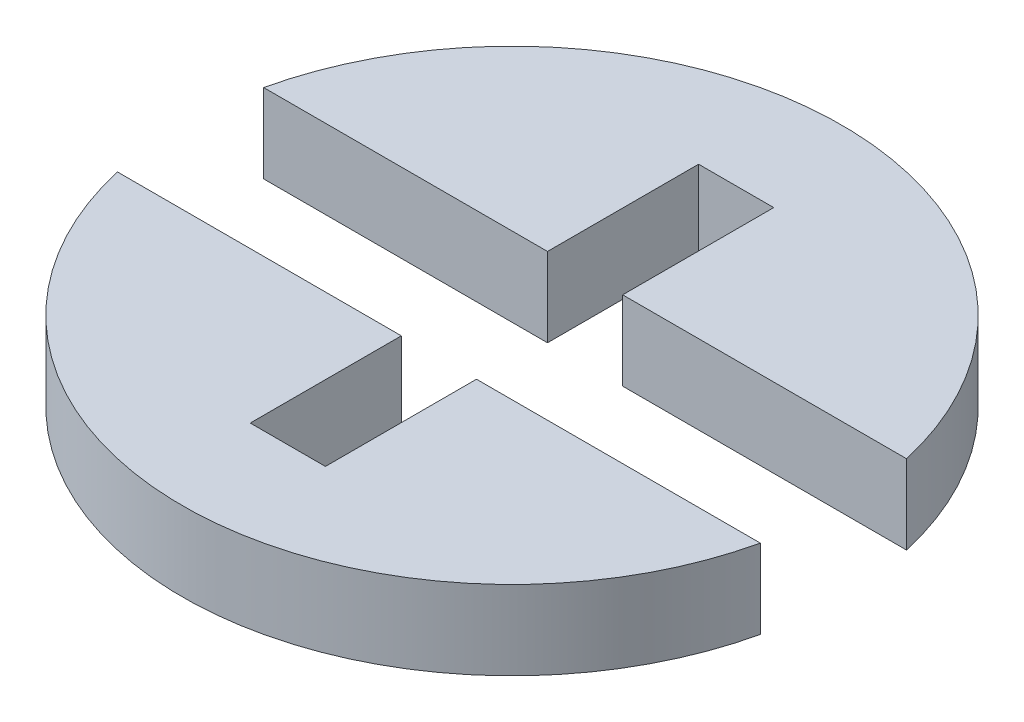
ISO-10303-21;
HEADER;
FILE_DESCRIPTION(('STEP AP214'),'2;1');
FILE_NAME('part.step','',(''),(''),'','','');
FILE_SCHEMA(('AUTOMOTIVE_DESIGN { 1 0 10303 214 1 1 1 1 }'));
ENDSEC;
DATA;
#1=APPLICATION_CONTEXT('core data for automotive mechanical design processes');
#2=APPLICATION_PROTOCOL_DEFINITION('international standard','automotive_design',2000,#1);
#3=PRODUCT_CONTEXT('',#1,'mechanical');
#4=PRODUCT('Part','Part','',(#3));
#5=PRODUCT_RELATED_PRODUCT_CATEGORY('part','',(#4));
#6=PRODUCT_DEFINITION_FORMATION('','',#4);
#7=PRODUCT_DEFINITION_CONTEXT('part definition',#1,'design');
#8=PRODUCT_DEFINITION('design','',#6,#7);
#9=PRODUCT_DEFINITION_SHAPE('','',#8);
#10=(LENGTH_UNIT() NAMED_UNIT(*) SI_UNIT(.MILLI.,.METRE.));
#11=(NAMED_UNIT(*) PLANE_ANGLE_UNIT() SI_UNIT($,.RADIAN.));
#12=(NAMED_UNIT(*) SI_UNIT($,.STERADIAN.) SOLID_ANGLE_UNIT());
#13=UNCERTAINTY_MEASURE_WITH_UNIT(LENGTH_MEASURE(1.E-05),#10,'distance_accuracy_value','');
#14=(GEOMETRIC_REPRESENTATION_CONTEXT(3) GLOBAL_UNCERTAINTY_ASSIGNED_CONTEXT((#13)) GLOBAL_UNIT_ASSIGNED_CONTEXT((#10,
#11,#12)) REPRESENTATION_CONTEXT('',''));
#15=CARTESIAN_POINT('',(0.,0.,0.));
#16=DIRECTION('',(0.,0.,1.));
#17=DIRECTION('',(1.,0.,0.));
#18=AXIS2_PLACEMENT_3D('',#15,#16,#17);
#19=CARTESIAN_POINT('',(0.,-1.5,0.));
#20=DIRECTION('',(0.,1.,0.));
#21=DIRECTION('',(0.,0.,1.));
#22=AXIS2_PLACEMENT_3D('',#19,#20,#21);
#23=CYLINDRICAL_SURFACE('',#22,12.5);
#24=DIRECTION('',(0.,1.,0.));
#25=VECTOR('',#24,1.);
#26=CARTESIAN_POINT('',(12.1889294033561,-1.5,2.7712812921102));
#27=LINE('',#26,#25);
#28=CARTESIAN_POINT('',(12.1889294033561,1.5,2.7712812921102));
#29=VERTEX_POINT('',#28);
#30=CARTESIAN_POINT('',(12.1889294033561,-1.5,2.7712812921102));
#31=VERTEX_POINT('',#30);
#32=EDGE_CURVE('E121',#29,#31,#27,.F.);
#33=ORIENTED_EDGE('',*,*,#32,.F.);
#34=CARTESIAN_POINT('',(0.,1.5,0.));
#35=DIRECTION('',(0.,1.,0.));
#36=DIRECTION('',(0.,0.,1.));
#37=AXIS2_PLACEMENT_3D('',#34,#35,#36);
#38=CIRCLE('',#37,12.5);
#39=CARTESIAN_POINT('',(-12.1889294033561,1.5,2.7712812921102));
#40=VERTEX_POINT('',#39);
#41=EDGE_CURVE('E142',#40,#29,#38,.T.);
#42=ORIENTED_EDGE('',*,*,#41,.F.);
#43=DIRECTION('',(0.,1.,0.));
#44=VECTOR('',#43,1.);
#45=CARTESIAN_POINT('',(-12.1889294033561,-1.5,2.7712812921102));
#46=LINE('',#45,#44);
#47=CARTESIAN_POINT('',(-12.1889294033561,-1.5,2.7712812921102));
#48=VERTEX_POINT('',#47);
#49=EDGE_CURVE('E52',#48,#40,#46,.T.);
#50=ORIENTED_EDGE('',*,*,#49,.F.);
#51=CARTESIAN_POINT('',(0.,-1.5,0.));
#52=DIRECTION('',(0.,1.,0.));
#53=DIRECTION('',(0.,0.,1.));
#54=AXIS2_PLACEMENT_3D('',#51,#52,#53);
#55=CIRCLE('',#54,12.5);
#56=EDGE_CURVE('E135',#48,#31,#55,.T.);
#57=ORIENTED_EDGE('',*,*,#56,.T.);
#58=EDGE_LOOP('',(#33,#42,#50,#57));
#59=FACE_BOUND('',#58,.T.);
#60=ADVANCED_FACE('F43',(#59),#23,.T.);
#61=CARTESIAN_POINT('',(0.,-1.5,0.));
#62=DIRECTION('',(0.,1.,0.));
#63=DIRECTION('',(0.,0.,1.));
#64=AXIS2_PLACEMENT_3D('',#61,#62,#63);
#65=PLANE('',#64);
#66=ORIENTED_EDGE('',*,*,#56,.F.);
#67=DIRECTION('',(1.,0.,0.));
#68=VECTOR('',#67,1.);
#69=CARTESIAN_POINT('',(0.,-1.5,2.7712812921102));
#70=LINE('',#69,#68);
#71=CARTESIAN_POINT('',(-1.425,-1.5,2.7712812921102));
#72=VERTEX_POINT('',#71);
#73=EDGE_CURVE('E62',#48,#72,#70,.T.);
#74=ORIENTED_EDGE('',*,*,#73,.T.);
#75=DIRECTION('',(0.,0.,1.));
#76=VECTOR('',#75,1.);
#77=CARTESIAN_POINT('',(-1.425,-1.5,-8.5));
#78=LINE('',#77,#76);
#79=CARTESIAN_POINT('',(-1.425,-1.5,8.5));
#80=VERTEX_POINT('',#79);
#81=EDGE_CURVE('E134',#72,#80,#78,.T.);
#82=ORIENTED_EDGE('',*,*,#81,.T.);
#83=DIRECTION('',(1.,0.,0.));
#84=VECTOR('',#83,1.);
#85=CARTESIAN_POINT('',(-1.425,-1.5,8.5));
#86=LINE('',#85,#84);
#87=CARTESIAN_POINT('',(1.425,-1.5,8.5));
#88=VERTEX_POINT('',#87);
#89=EDGE_CURVE('E131',#80,#88,#86,.T.);
#90=ORIENTED_EDGE('',*,*,#89,.T.);
#91=DIRECTION('',(0.,0.,-1.));
#92=VECTOR('',#91,1.);
#93=CARTESIAN_POINT('',(1.425,-1.5,-8.5));
#94=LINE('',#93,#92);
#95=CARTESIAN_POINT('',(1.425,-1.5,2.7712812921102));
#96=VERTEX_POINT('',#95);
#97=EDGE_CURVE('E110',#88,#96,#94,.T.);
#98=ORIENTED_EDGE('',*,*,#97,.T.);
#99=EDGE_CURVE('E81',#96,#31,#70,.T.);
#100=ORIENTED_EDGE('',*,*,#99,.T.);
#101=EDGE_LOOP('',(#66,#74,#82,#90,#98,#100));
#102=FACE_BOUND('',#101,.T.);
#103=ADVANCED_FACE('F147',(#102),#65,.F.);
#104=CARTESIAN_POINT('',(1.425,-1.5,-8.5));
#105=DIRECTION('',(1.,0.,0.));
#106=DIRECTION('',(0.,0.,-1.));
#107=AXIS2_PLACEMENT_3D('',#104,#105,#106);
#108=PLANE('',#107);
#109=DIRECTION('',(0.,0.,-1.));
#110=VECTOR('',#109,1.);
#111=CARTESIAN_POINT('',(1.425,1.5,-8.5));
#112=LINE('',#111,#110);
#113=CARTESIAN_POINT('',(1.425,1.5,8.5));
#114=VERTEX_POINT('',#113);
#115=CARTESIAN_POINT('',(1.425,1.5,2.7712812921102));
#116=VERTEX_POINT('',#115);
#117=EDGE_CURVE('E46',#114,#116,#112,.T.);
#118=ORIENTED_EDGE('',*,*,#117,.T.);
#119=DIRECTION('',(0.,-1.,0.));
#120=VECTOR('',#119,1.);
#121=CARTESIAN_POINT('',(1.425,-1.5,2.7712812921102));
#122=LINE('',#121,#120);
#123=EDGE_CURVE('E85',#116,#96,#122,.T.);
#124=ORIENTED_EDGE('',*,*,#123,.T.);
#125=ORIENTED_EDGE('',*,*,#97,.F.);
#126=DIRECTION('',(0.,1.,0.));
#127=VECTOR('',#126,1.);
#128=CARTESIAN_POINT('',(1.425,-1.5,8.5));
#129=LINE('',#128,#127);
#130=EDGE_CURVE('E105',#88,#114,#129,.T.);
#131=ORIENTED_EDGE('',*,*,#130,.T.);
#132=EDGE_LOOP('',(#118,#124,#125,#131));
#133=FACE_BOUND('',#132,.T.);
#134=ADVANCED_FACE('F107',(#133),#108,.F.);
#135=CARTESIAN_POINT('',(-1.425,-1.5,-8.5));
#136=DIRECTION('',(-1.,0.,0.));
#137=DIRECTION('',(0.,0.,1.));
#138=AXIS2_PLACEMENT_3D('',#135,#136,#137);
#139=PLANE('',#138);
#140=ORIENTED_EDGE('',*,*,#81,.F.);
#141=DIRECTION('',(0.,1.,0.));
#142=VECTOR('',#141,1.);
#143=CARTESIAN_POINT('',(-1.425,-1.5,2.7712812921102));
#144=LINE('',#143,#142);
#145=CARTESIAN_POINT('',(-1.425,1.5,2.7712812921102));
#146=VERTEX_POINT('',#145);
#147=EDGE_CURVE('E114',#72,#146,#144,.T.);
#148=ORIENTED_EDGE('',*,*,#147,.T.);
#149=DIRECTION('',(0.,0.,1.));
#150=VECTOR('',#149,1.);
#151=CARTESIAN_POINT('',(-1.425,1.5,-8.5));
#152=LINE('',#151,#150);
#153=CARTESIAN_POINT('',(-1.425,1.5,8.5));
#154=VERTEX_POINT('',#153);
#155=EDGE_CURVE('E99',#146,#154,#152,.T.);
#156=ORIENTED_EDGE('',*,*,#155,.T.);
#157=DIRECTION('',(0.,1.,0.));
#158=VECTOR('',#157,1.);
#159=CARTESIAN_POINT('',(-1.425,-1.5,8.5));
#160=LINE('',#159,#158);
#161=EDGE_CURVE('E119',#80,#154,#160,.T.);
#162=ORIENTED_EDGE('',*,*,#161,.F.);
#163=EDGE_LOOP('',(#140,#148,#156,#162));
#164=FACE_BOUND('',#163,.T.);
#165=ADVANCED_FACE('F148',(#164),#139,.F.);
#166=CARTESIAN_POINT('',(0.,1.5,0.));
#167=DIRECTION('',(0.,1.,0.));
#168=DIRECTION('',(0.,0.,1.));
#169=AXIS2_PLACEMENT_3D('',#166,#167,#168);
#170=PLANE('',#169);
#171=DIRECTION('',(1.,0.,0.));
#172=VECTOR('',#171,1.);
#173=CARTESIAN_POINT('',(0.,1.5,2.7712812921102));
#174=LINE('',#173,#172);
#175=EDGE_CURVE('E12',#40,#146,#174,.T.);
#176=ORIENTED_EDGE('',*,*,#175,.F.);
#177=ORIENTED_EDGE('',*,*,#41,.T.);
#178=EDGE_CURVE('E54',#116,#29,#174,.T.);
#179=ORIENTED_EDGE('',*,*,#178,.F.);
#180=ORIENTED_EDGE('',*,*,#117,.F.);
#181=DIRECTION('',(1.,0.,0.));
#182=VECTOR('',#181,1.);
#183=CARTESIAN_POINT('',(-1.425,1.5,8.5));
#184=LINE('',#183,#182);
#185=EDGE_CURVE('E117',#154,#114,#184,.T.);
#186=ORIENTED_EDGE('',*,*,#185,.F.);
#187=ORIENTED_EDGE('',*,*,#155,.F.);
#188=EDGE_LOOP('',(#176,#177,#179,#180,#186,#187));
#189=FACE_BOUND('',#188,.T.);
#190=ADVANCED_FACE('F124',(#189),#170,.T.);
#191=CARTESIAN_POINT('',(-1.425,-1.5,8.5));
#192=DIRECTION('',(0.,0.,1.));
#193=DIRECTION('',(1.,0.,0.));
#194=AXIS2_PLACEMENT_3D('',#191,#192,#193);
#195=PLANE('',#194);
#196=ORIENTED_EDGE('',*,*,#161,.T.);
#197=ORIENTED_EDGE('',*,*,#185,.T.);
#198=ORIENTED_EDGE('',*,*,#130,.F.);
#199=ORIENTED_EDGE('',*,*,#89,.F.);
#200=EDGE_LOOP('',(#196,#197,#198,#199));
#201=FACE_BOUND('',#200,.T.);
#202=ADVANCED_FACE('F118',(#201),#195,.F.);
#203=CARTESIAN_POINT('',(-12.5,1.6,2.7712812921102));
#204=DIRECTION('',(0.,0.,1.));
#205=DIRECTION('',(1.,0.,0.));
#206=AXIS2_PLACEMENT_3D('',#203,#204,#205);
#207=PLANE('',#206);
#208=ORIENTED_EDGE('',*,*,#32,.T.);
#209=ORIENTED_EDGE('',*,*,#99,.F.);
#210=ORIENTED_EDGE('',*,*,#123,.F.);
#211=ORIENTED_EDGE('',*,*,#178,.T.);
#212=EDGE_LOOP('',(#208,#209,#210,#211));
#213=FACE_BOUND('',#212,.T.);
#214=ADVANCED_FACE('F164',(#213),#207,.F.);
#215=ORIENTED_EDGE('',*,*,#49,.T.);
#216=ORIENTED_EDGE('',*,*,#175,.T.);
#217=ORIENTED_EDGE('',*,*,#147,.F.);
#218=ORIENTED_EDGE('',*,*,#73,.F.);
#219=EDGE_LOOP('',(#215,#216,#217,#218));
#220=FACE_BOUND('',#219,.T.);
#221=ADVANCED_FACE('F162',(#220),#207,.F.);
#222=CLOSED_SHELL('',(#60,#103,#134,#165,#190,#202,#214,#221));
#223=MANIFOLD_SOLID_BREP('B2',#222);
#224=CARTESIAN_POINT('',(-1.425,-1.5,-8.5));
#225=DIRECTION('',(0.,0.,-1.));
#226=DIRECTION('',(-1.,0.,0.));
#227=AXIS2_PLACEMENT_3D('',#224,#225,#226);
#228=PLANE('',#227);
#229=DIRECTION('',(0.,1.,0.));
#230=VECTOR('',#229,1.);
#231=CARTESIAN_POINT('',(1.425,-1.5,-8.5));
#232=LINE('',#231,#230);
#233=CARTESIAN_POINT('',(1.425,-1.5,-8.5));
#234=VERTEX_POINT('',#233);
#235=CARTESIAN_POINT('',(1.425,1.5,-8.5));
#236=VERTEX_POINT('',#235);
#237=EDGE_CURVE('E298',#234,#236,#232,.T.);
#238=ORIENTED_EDGE('',*,*,#237,.T.);
#239=DIRECTION('',(-1.,0.,0.));
#240=VECTOR('',#239,1.);
#241=CARTESIAN_POINT('',(-1.425,1.5,-8.5));
#242=LINE('',#241,#240);
#243=CARTESIAN_POINT('',(-1.425,1.5,-8.5));
#244=VERTEX_POINT('',#243);
#245=EDGE_CURVE('E289',#236,#244,#242,.T.);
#246=ORIENTED_EDGE('',*,*,#245,.T.);
#247=DIRECTION('',(0.,1.,0.));
#248=VECTOR('',#247,1.);
#249=CARTESIAN_POINT('',(-1.425,-1.5,-8.5));
#250=LINE('',#249,#248);
#251=CARTESIAN_POINT('',(-1.425,-1.5,-8.5));
#252=VERTEX_POINT('',#251);
#253=EDGE_CURVE('E299',#252,#244,#250,.T.);
#254=ORIENTED_EDGE('',*,*,#253,.F.);
#255=DIRECTION('',(-1.,0.,0.));
#256=VECTOR('',#255,1.);
#257=CARTESIAN_POINT('',(-1.425,-1.5,-8.5));
#258=LINE('',#257,#256);
#259=EDGE_CURVE('E287',#234,#252,#258,.T.);
#260=ORIENTED_EDGE('',*,*,#259,.F.);
#261=EDGE_LOOP('',(#238,#246,#254,#260));
#262=FACE_BOUND('',#261,.T.);
#263=ADVANCED_FACE('F216',(#262),#228,.F.);
#264=CARTESIAN_POINT('',(0.,1.5,0.));
#265=DIRECTION('',(0.,1.,0.));
#266=DIRECTION('',(0.,0.,1.));
#267=AXIS2_PLACEMENT_3D('',#264,#265,#266);
#268=PLANE('',#267);
#269=DIRECTION('',(-1.,0.,0.));
#270=VECTOR('',#269,1.);
#271=CARTESIAN_POINT('',(0.,1.5,-2.7712812921102));
#272=LINE('',#271,#270);
#273=CARTESIAN_POINT('',(12.1889294033561,1.5,-2.7712812921102));
#274=VERTEX_POINT('',#273);
#275=CARTESIAN_POINT('',(1.425,1.5,-2.7712812921102));
#276=VERTEX_POINT('',#275);
#277=EDGE_CURVE('E41',#274,#276,#272,.T.);
#278=ORIENTED_EDGE('',*,*,#277,.F.);
#279=CARTESIAN_POINT('',(0.,1.5,0.));
#280=DIRECTION('',(0.,1.,0.));
#281=DIRECTION('',(0.,0.,1.));
#282=AXIS2_PLACEMENT_3D('',#279,#280,#281);
#283=CIRCLE('',#282,12.5);
#284=CARTESIAN_POINT('',(-12.1889294033561,1.5,-2.7712812921102));
#285=VERTEX_POINT('',#284);
#286=EDGE_CURVE('E277',#274,#285,#283,.T.);
#287=ORIENTED_EDGE('',*,*,#286,.T.);
#288=CARTESIAN_POINT('',(-1.425,1.5,-2.7712812921102));
#289=VERTEX_POINT('',#288);
#290=EDGE_CURVE('E220',#289,#285,#272,.T.);
#291=ORIENTED_EDGE('',*,*,#290,.F.);
#292=DIRECTION('',(0.,0.,1.));
#293=VECTOR('',#292,1.);
#294=CARTESIAN_POINT('',(-1.425,1.5,-8.5));
#295=LINE('',#294,#293);
#296=EDGE_CURVE('E285',#244,#289,#295,.T.);
#297=ORIENTED_EDGE('',*,*,#296,.F.);
#298=ORIENTED_EDGE('',*,*,#245,.F.);
#299=DIRECTION('',(0.,0.,-1.));
#300=VECTOR('',#299,1.);
#301=CARTESIAN_POINT('',(1.425,1.5,-8.5));
#302=LINE('',#301,#300);
#303=EDGE_CURVE('E310',#276,#236,#302,.T.);
#304=ORIENTED_EDGE('',*,*,#303,.F.);
#305=EDGE_LOOP('',(#278,#287,#291,#297,#298,#304));
#306=FACE_BOUND('',#305,.T.);
#307=ADVANCED_FACE('F282',(#306),#268,.T.);
#308=CARTESIAN_POINT('',(-1.425,-1.5,-8.5));
#309=DIRECTION('',(-1.,0.,0.));
#310=DIRECTION('',(0.,0.,1.));
#311=AXIS2_PLACEMENT_3D('',#308,#309,#310);
#312=PLANE('',#311);
#313=ORIENTED_EDGE('',*,*,#296,.T.);
#314=DIRECTION('',(0.,-1.,0.));
#315=VECTOR('',#314,1.);
#316=CARTESIAN_POINT('',(-1.425,-1.5,-2.7712812921102));
#317=LINE('',#316,#315);
#318=CARTESIAN_POINT('',(-1.425,-1.5,-2.7712812921102));
#319=VERTEX_POINT('',#318);
#320=EDGE_CURVE('E231',#289,#319,#317,.T.);
#321=ORIENTED_EDGE('',*,*,#320,.T.);
#322=DIRECTION('',(0.,0.,1.));
#323=VECTOR('',#322,1.);
#324=CARTESIAN_POINT('',(-1.425,-1.5,-8.5));
#325=LINE('',#324,#323);
#326=EDGE_CURVE('E295',#252,#319,#325,.T.);
#327=ORIENTED_EDGE('',*,*,#326,.F.);
#328=ORIENTED_EDGE('',*,*,#253,.T.);
#329=EDGE_LOOP('',(#313,#321,#327,#328));
#330=FACE_BOUND('',#329,.T.);
#331=ADVANCED_FACE('F319',(#330),#312,.F.);
#332=CARTESIAN_POINT('',(1.425,-1.5,-8.5));
#333=DIRECTION('',(1.,0.,0.));
#334=DIRECTION('',(0.,0.,-1.));
#335=AXIS2_PLACEMENT_3D('',#332,#333,#334);
#336=PLANE('',#335);
#337=DIRECTION('',(0.,0.,-1.));
#338=VECTOR('',#337,1.);
#339=CARTESIAN_POINT('',(1.425,-1.5,-8.5));
#340=LINE('',#339,#338);
#341=CARTESIAN_POINT('',(1.425,-1.5,-2.7712812921102));
#342=VERTEX_POINT('',#341);
#343=EDGE_CURVE('E284',#342,#234,#340,.T.);
#344=ORIENTED_EDGE('',*,*,#343,.F.);
#345=DIRECTION('',(0.,1.,0.));
#346=VECTOR('',#345,1.);
#347=CARTESIAN_POINT('',(1.425,-1.5,-2.7712812921102));
#348=LINE('',#347,#346);
#349=EDGE_CURVE('E279',#342,#276,#348,.T.);
#350=ORIENTED_EDGE('',*,*,#349,.T.);
#351=ORIENTED_EDGE('',*,*,#303,.T.);
#352=ORIENTED_EDGE('',*,*,#237,.F.);
#353=EDGE_LOOP('',(#344,#350,#351,#352));
#354=FACE_BOUND('',#353,.T.);
#355=ADVANCED_FACE('F323',(#354),#336,.F.);
#356=CARTESIAN_POINT('',(0.,-1.5,0.));
#357=DIRECTION('',(0.,1.,0.));
#358=DIRECTION('',(0.,0.,1.));
#359=AXIS2_PLACEMENT_3D('',#356,#357,#358);
#360=PLANE('',#359);
#361=CARTESIAN_POINT('',(0.,-1.5,0.));
#362=DIRECTION('',(0.,1.,0.));
#363=DIRECTION('',(0.,0.,1.));
#364=AXIS2_PLACEMENT_3D('',#361,#362,#363);
#365=CIRCLE('',#364,12.5);
#366=CARTESIAN_POINT('',(12.1889294033561,-1.5,-2.7712812921102));
#367=VERTEX_POINT('',#366);
#368=CARTESIAN_POINT('',(-12.1889294033561,-1.5,-2.7712812921102));
#369=VERTEX_POINT('',#368);
#370=EDGE_CURVE('E273',#367,#369,#365,.T.);
#371=ORIENTED_EDGE('',*,*,#370,.F.);
#372=DIRECTION('',(-1.,0.,0.));
#373=VECTOR('',#372,1.);
#374=CARTESIAN_POINT('',(0.,-1.5,-2.7712812921102));
#375=LINE('',#374,#373);
#376=EDGE_CURVE('E314',#367,#342,#375,.T.);
#377=ORIENTED_EDGE('',*,*,#376,.T.);
#378=ORIENTED_EDGE('',*,*,#343,.T.);
#379=ORIENTED_EDGE('',*,*,#259,.T.);
#380=ORIENTED_EDGE('',*,*,#326,.T.);
#381=EDGE_CURVE('E280',#319,#369,#375,.T.);
#382=ORIENTED_EDGE('',*,*,#381,.T.);
#383=EDGE_LOOP('',(#371,#377,#378,#379,#380,#382));
#384=FACE_BOUND('',#383,.T.);
#385=ADVANCED_FACE('F321',(#384),#360,.F.);
#386=CARTESIAN_POINT('',(0.,-1.5,0.));
#387=DIRECTION('',(0.,1.,0.));
#388=DIRECTION('',(0.,0.,1.));
#389=AXIS2_PLACEMENT_3D('',#386,#387,#388);
#390=CYLINDRICAL_SURFACE('',#389,12.5);
#391=DIRECTION('',(0.,1.,0.));
#392=VECTOR('',#391,1.);
#393=CARTESIAN_POINT('',(-12.1889294033561,-1.5,-2.7712812921102));
#394=LINE('',#393,#392);
#395=EDGE_CURVE('E267',#285,#369,#394,.F.);
#396=ORIENTED_EDGE('',*,*,#395,.F.);
#397=ORIENTED_EDGE('',*,*,#286,.F.);
#398=DIRECTION('',(0.,1.,0.));
#399=VECTOR('',#398,1.);
#400=CARTESIAN_POINT('',(12.1889294033561,-1.5,-2.7712812921102));
#401=LINE('',#400,#399);
#402=EDGE_CURVE('E238',#367,#274,#401,.T.);
#403=ORIENTED_EDGE('',*,*,#402,.F.);
#404=ORIENTED_EDGE('',*,*,#370,.T.);
#405=EDGE_LOOP('',(#396,#397,#403,#404));
#406=FACE_BOUND('',#405,.T.);
#407=ADVANCED_FACE('F218',(#406),#390,.T.);
#408=CARTESIAN_POINT('',(-12.5,-1.6,-2.7712812921102));
#409=DIRECTION('',(0.,0.,-1.));
#410=DIRECTION('',(0.,1.,0.));
#411=AXIS2_PLACEMENT_3D('',#408,#409,#410);
#412=PLANE('',#411);
#413=ORIENTED_EDGE('',*,*,#395,.T.);
#414=ORIENTED_EDGE('',*,*,#381,.F.);
#415=ORIENTED_EDGE('',*,*,#320,.F.);
#416=ORIENTED_EDGE('',*,*,#290,.T.);
#417=EDGE_LOOP('',(#413,#414,#415,#416));
#418=FACE_BOUND('',#417,.T.);
#419=ADVANCED_FACE('F266',(#418),#412,.F.);
#420=ORIENTED_EDGE('',*,*,#402,.T.);
#421=ORIENTED_EDGE('',*,*,#277,.T.);
#422=ORIENTED_EDGE('',*,*,#349,.F.);
#423=ORIENTED_EDGE('',*,*,#376,.F.);
#424=EDGE_LOOP('',(#420,#421,#422,#423));
#425=FACE_BOUND('',#424,.T.);
#426=ADVANCED_FACE('F324',(#425),#412,.F.);
#427=CLOSED_SHELL('',(#263,#307,#331,#355,#385,#407,#419,#426));
#428=MANIFOLD_SOLID_BREP('B6',#427);
#429=ADVANCED_BREP_SHAPE_REPRESENTATION('',(#18,#223,#428),#14);
#430=SHAPE_DEFINITION_REPRESENTATION(#9,#429);
ENDSEC;
END-ISO-10303-21;
